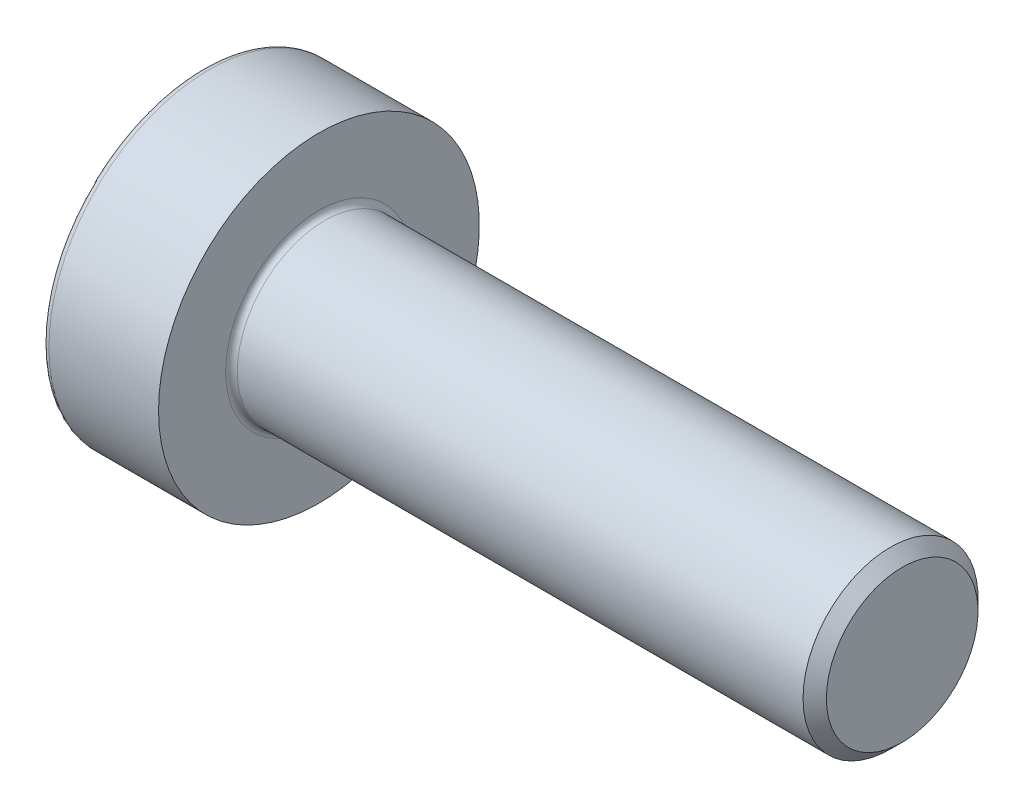
ISO-10303-21;
HEADER;
FILE_DESCRIPTION(('STEP AP214'),'2;1');
FILE_NAME('part.step','',(''),(''),'','','');
FILE_SCHEMA(('AUTOMOTIVE_DESIGN { 1 0 10303 214 1 1 1 1 }'));
ENDSEC;
DATA;
#1=APPLICATION_CONTEXT('core data for automotive mechanical design processes');
#2=APPLICATION_PROTOCOL_DEFINITION('international standard','automotive_design',2000,#1);
#3=PRODUCT_CONTEXT('',#1,'mechanical');
#4=PRODUCT('Part','Part','',(#3));
#5=PRODUCT_RELATED_PRODUCT_CATEGORY('part','',(#4));
#6=PRODUCT_DEFINITION_FORMATION('','',#4);
#7=PRODUCT_DEFINITION_CONTEXT('part definition',#1,'design');
#8=PRODUCT_DEFINITION('design','',#6,#7);
#9=PRODUCT_DEFINITION_SHAPE('','',#8);
#10=(LENGTH_UNIT() NAMED_UNIT(*) SI_UNIT(.MILLI.,.METRE.));
#11=(NAMED_UNIT(*) PLANE_ANGLE_UNIT() SI_UNIT($,.RADIAN.));
#12=(NAMED_UNIT(*) SI_UNIT($,.STERADIAN.) SOLID_ANGLE_UNIT());
#13=UNCERTAINTY_MEASURE_WITH_UNIT(LENGTH_MEASURE(1.E-05),#10,'distance_accuracy_value','');
#14=(GEOMETRIC_REPRESENTATION_CONTEXT(3) GLOBAL_UNCERTAINTY_ASSIGNED_CONTEXT((#13)) GLOBAL_UNIT_ASSIGNED_CONTEXT((#10,
#11,#12)) REPRESENTATION_CONTEXT('',''));
#15=CARTESIAN_POINT('',(0.,0.,0.));
#16=DIRECTION('',(0.,0.,1.));
#17=DIRECTION('',(1.,0.,0.));
#18=AXIS2_PLACEMENT_3D('',#15,#16,#17);
#19=CARTESIAN_POINT('',(12.,0.,0.));
#20=DIRECTION('',(-1.,0.,0.));
#21=DIRECTION('',(0.,0.,1.));
#22=AXIS2_PLACEMENT_3D('',#19,#20,#21);
#23=PLANE('',#22);
#24=CARTESIAN_POINT('',(12.,0.,0.));
#25=DIRECTION('',(-1.,0.,0.));
#26=DIRECTION('',(0.,0.,1.));
#27=AXIS2_PLACEMENT_3D('',#24,#25,#26);
#28=CIRCLE('',#27,1.3);
#29=CARTESIAN_POINT('',(12.,0.,1.3));
#30=VERTEX_POINT('',#29);
#31=EDGE_CURVE('E11',#30,#30,#28,.F.);
#32=ORIENTED_EDGE('',*,*,#31,.T.);
#33=EDGE_LOOP('',(#32));
#34=FACE_BOUND('',#33,.T.);
#35=ADVANCED_FACE('F37',(#34),#23,.F.);
#36=CARTESIAN_POINT('',(0.,0.,0.));
#37=DIRECTION('',(-1.,0.,0.));
#38=DIRECTION('',(0.,0.,1.));
#39=AXIS2_PLACEMENT_3D('',#36,#37,#38);
#40=CYLINDRICAL_SURFACE('',#39,1.5);
#41=CARTESIAN_POINT('',(11.8,0.,0.));
#42=DIRECTION('',(-1.,0.,0.));
#43=DIRECTION('',(0.,0.,1.));
#44=AXIS2_PLACEMENT_3D('',#41,#42,#43);
#45=CIRCLE('',#44,1.5);
#46=CARTESIAN_POINT('',(11.8,0.,1.5));
#47=VERTEX_POINT('',#46);
#48=EDGE_CURVE('E45',#47,#47,#45,.T.);
#49=ORIENTED_EDGE('',*,*,#48,.T.);
#50=EDGE_LOOP('',(#49));
#51=FACE_BOUND('',#50,.T.);
#52=CARTESIAN_POINT('',(2.1,0.,0.));
#53=DIRECTION('',(1.,0.,0.));
#54=DIRECTION('',(0.,0.,-1.));
#55=AXIS2_PLACEMENT_3D('',#52,#53,#54);
#56=CIRCLE('',#55,1.5);
#57=CARTESIAN_POINT('',(2.1,0.,-1.5));
#58=VERTEX_POINT('',#57);
#59=EDGE_CURVE('E150',#58,#58,#56,.T.);
#60=ORIENTED_EDGE('',*,*,#59,.T.);
#61=EDGE_LOOP('',(#60));
#62=FACE_BOUND('',#61,.T.);
#63=ADVANCED_FACE('F161',(#51,#62),#40,.T.);
#64=CARTESIAN_POINT('',(2.,0.,0.));
#65=DIRECTION('',(1.,0.,0.));
#66=DIRECTION('',(0.,0.,-1.));
#67=AXIS2_PLACEMENT_3D('',#64,#65,#66);
#68=PLANE('',#67);
#69=CARTESIAN_POINT('',(2.,0.,0.));
#70=DIRECTION('',(1.,0.,0.));
#71=DIRECTION('',(0.,0.,-1.));
#72=AXIS2_PLACEMENT_3D('',#69,#70,#71);
#73=CIRCLE('',#72,1.6);
#74=CARTESIAN_POINT('',(2.,0.,-1.6));
#75=VERTEX_POINT('',#74);
#76=EDGE_CURVE('E147',#75,#75,#73,.F.);
#77=ORIENTED_EDGE('',*,*,#76,.T.);
#78=EDGE_LOOP('',(#77));
#79=FACE_BOUND('',#78,.T.);
#80=CARTESIAN_POINT('',(2.,0.,0.));
#81=DIRECTION('',(-1.,0.,0.));
#82=DIRECTION('',(0.,0.,1.));
#83=AXIS2_PLACEMENT_3D('',#80,#81,#82);
#84=CIRCLE('',#83,2.75);
#85=CARTESIAN_POINT('',(2.,0.,2.75));
#86=VERTEX_POINT('',#85);
#87=EDGE_CURVE('E139',#86,#86,#84,.T.);
#88=ORIENTED_EDGE('',*,*,#87,.F.);
#89=EDGE_LOOP('',(#88));
#90=FACE_BOUND('',#89,.T.);
#91=ADVANCED_FACE('F183',(#79,#90),#68,.T.);
#92=CARTESIAN_POINT('',(0.,0.,0.));
#93=DIRECTION('',(-1.,0.,0.));
#94=DIRECTION('',(0.,0.,1.));
#95=AXIS2_PLACEMENT_3D('',#92,#93,#94);
#96=CYLINDRICAL_SURFACE('',#95,2.75);
#97=CARTESIAN_POINT('',(0.12,0.,0.));
#98=DIRECTION('',(-1.,0.,0.));
#99=DIRECTION('',(0.,0.,1.));
#100=AXIS2_PLACEMENT_3D('',#97,#98,#99);
#101=CIRCLE('',#100,2.75);
#102=CARTESIAN_POINT('',(0.12,0.,2.75));
#103=VERTEX_POINT('',#102);
#104=EDGE_CURVE('E156',#103,#103,#101,.F.);
#105=ORIENTED_EDGE('',*,*,#104,.T.);
#106=EDGE_LOOP('',(#105));
#107=FACE_BOUND('',#106,.T.);
#108=ORIENTED_EDGE('',*,*,#87,.T.);
#109=EDGE_LOOP('',(#108));
#110=FACE_BOUND('',#109,.T.);
#111=ADVANCED_FACE('F193',(#107,#110),#96,.T.);
#112=CARTESIAN_POINT('',(0.,0.,0.));
#113=DIRECTION('',(-1.,0.,0.));
#114=DIRECTION('',(0.,0.,1.));
#115=AXIS2_PLACEMENT_3D('',#112,#113,#114);
#116=PLANE('',#115);
#117=DIRECTION('',(0.,0.5,-0.866025403784439));
#118=VECTOR('',#117,1.);
#119=CARTESIAN_POINT('',(0.,0.721687836487033,1.25));
#120=LINE('',#119,#118);
#121=CARTESIAN_POINT('',(0.,0.721687836487033,1.25));
#122=VERTEX_POINT('',#121);
#123=CARTESIAN_POINT('',(0.,1.44337567297406,0.));
#124=VERTEX_POINT('',#123);
#125=EDGE_CURVE('E52',#122,#124,#120,.T.);
#126=ORIENTED_EDGE('',*,*,#125,.F.);
#127=DIRECTION('',(0.,1.,0.));
#128=VECTOR('',#127,1.);
#129=CARTESIAN_POINT('',(0.,-0.721687836487032,1.25));
#130=LINE('',#129,#128);
#131=CARTESIAN_POINT('',(0.,-0.721687836487032,1.25));
#132=VERTEX_POINT('',#131);
#133=EDGE_CURVE('E135',#132,#122,#130,.T.);
#134=ORIENTED_EDGE('',*,*,#133,.F.);
#135=DIRECTION('',(0.,0.5,0.866025403784439));
#136=VECTOR('',#135,1.);
#137=CARTESIAN_POINT('',(0.,-1.44337567297406,0.));
#138=LINE('',#137,#136);
#139=CARTESIAN_POINT('',(0.,-1.44337567297406,0.));
#140=VERTEX_POINT('',#139);
#141=EDGE_CURVE('E133',#140,#132,#138,.T.);
#142=ORIENTED_EDGE('',*,*,#141,.F.);
#143=DIRECTION('',(0.,-0.5,0.866025403784439));
#144=VECTOR('',#143,1.);
#145=CARTESIAN_POINT('',(0.,-0.721687836487033,-1.25));
#146=LINE('',#145,#144);
#147=CARTESIAN_POINT('',(0.,-0.721687836487033,-1.25));
#148=VERTEX_POINT('',#147);
#149=EDGE_CURVE('E100',#148,#140,#146,.T.);
#150=ORIENTED_EDGE('',*,*,#149,.F.);
#151=DIRECTION('',(0.,-1.,0.));
#152=VECTOR('',#151,1.);
#153=CARTESIAN_POINT('',(0.,0.721687836487032,-1.25));
#154=LINE('',#153,#152);
#155=CARTESIAN_POINT('',(0.,0.721687836487032,-1.25));
#156=VERTEX_POINT('',#155);
#157=EDGE_CURVE('E129',#156,#148,#154,.T.);
#158=ORIENTED_EDGE('',*,*,#157,.F.);
#159=DIRECTION('',(0.,-0.5,-0.866025403784439));
#160=VECTOR('',#159,1.);
#161=CARTESIAN_POINT('',(0.,1.44337567297406,0.));
#162=LINE('',#161,#160);
#163=EDGE_CURVE('E126',#124,#156,#162,.T.);
#164=ORIENTED_EDGE('',*,*,#163,.F.);
#165=EDGE_LOOP('',(#126,#134,#142,#150,#158,#164));
#166=FACE_BOUND('',#165,.T.);
#167=CARTESIAN_POINT('',(0.,0.,0.));
#168=DIRECTION('',(-1.,0.,0.));
#169=DIRECTION('',(0.,0.,1.));
#170=AXIS2_PLACEMENT_3D('',#167,#168,#169);
#171=CIRCLE('',#170,2.63);
#172=CARTESIAN_POINT('',(0.,0.,2.63));
#173=VERTEX_POINT('',#172);
#174=EDGE_CURVE('E153',#173,#173,#171,.T.);
#175=ORIENTED_EDGE('',*,*,#174,.T.);
#176=EDGE_LOOP('',(#175));
#177=FACE_BOUND('',#176,.T.);
#178=ADVANCED_FACE('F188',(#166,#177),#116,.T.);
#179=CARTESIAN_POINT('',(2.1,0.,0.));
#180=DIRECTION('',(1.,0.,0.));
#181=DIRECTION('',(0.,0.,-1.));
#182=AXIS2_PLACEMENT_3D('',#179,#180,#181);
#183=TOROIDAL_SURFACE('',#182,1.6,0.1);
#184=ORIENTED_EDGE('',*,*,#59,.F.);
#185=EDGE_LOOP('',(#184));
#186=FACE_BOUND('',#185,.T.);
#187=ORIENTED_EDGE('',*,*,#76,.F.);
#188=EDGE_LOOP('',(#187));
#189=FACE_BOUND('',#188,.T.);
#190=ADVANCED_FACE('F174',(#186,#189),#183,.F.);
#191=CARTESIAN_POINT('',(0.12,0.,0.));
#192=DIRECTION('',(-1.,0.,0.));
#193=DIRECTION('',(0.,0.,1.));
#194=AXIS2_PLACEMENT_3D('',#191,#192,#193);
#195=TOROIDAL_SURFACE('',#194,2.63,0.12);
#196=ORIENTED_EDGE('',*,*,#104,.F.);
#197=EDGE_LOOP('',(#196));
#198=FACE_BOUND('',#197,.T.);
#199=ORIENTED_EDGE('',*,*,#174,.F.);
#200=EDGE_LOOP('',(#199));
#201=FACE_BOUND('',#200,.T.);
#202=ADVANCED_FACE('F166',(#198,#201),#195,.T.);
#203=CARTESIAN_POINT('',(11.8,0.,0.));
#204=DIRECTION('',(-1.,0.,0.));
#205=DIRECTION('',(0.,0.,1.));
#206=AXIS2_PLACEMENT_3D('',#203,#204,#205);
#207=CONICAL_SURFACE('',#206,1.5,0.785398163397448);
#208=ORIENTED_EDGE('',*,*,#31,.F.);
#209=EDGE_LOOP('',(#208));
#210=FACE_BOUND('',#209,.T.);
#211=ORIENTED_EDGE('',*,*,#48,.F.);
#212=EDGE_LOOP('',(#211));
#213=FACE_BOUND('',#212,.T.);
#214=ADVANCED_FACE('F39',(#210,#213),#207,.T.);
#215=CARTESIAN_POINT('',(1.,0.721687836487033,1.25));
#216=DIRECTION('',(0.,0.866025403784439,0.5));
#217=DIRECTION('',(0.,-0.5,0.866025403784439));
#218=AXIS2_PLACEMENT_3D('',#215,#216,#217);
#219=PLANE('',#218);
#220=ORIENTED_EDGE('',*,*,#125,.T.);
#221=DIRECTION('',(-1.,0.,0.));
#222=VECTOR('',#221,1.);
#223=CARTESIAN_POINT('',(1.,1.44337567297406,0.));
#224=LINE('',#223,#222);
#225=CARTESIAN_POINT('',(1.,1.44337567297406,0.));
#226=VERTEX_POINT('',#225);
#227=EDGE_CURVE('E82',#226,#124,#224,.T.);
#228=ORIENTED_EDGE('',*,*,#227,.F.);
#229=DIRECTION('',(0.,0.5,-0.866025403784439));
#230=VECTOR('',#229,1.);
#231=CARTESIAN_POINT('',(1.,0.721687836487033,1.25));
#232=LINE('',#231,#230);
#233=CARTESIAN_POINT('',(1.,0.721687836487033,1.25));
#234=VERTEX_POINT('',#233);
#235=EDGE_CURVE('E137',#234,#226,#232,.T.);
#236=ORIENTED_EDGE('',*,*,#235,.F.);
#237=DIRECTION('',(-1.,0.,0.));
#238=VECTOR('',#237,1.);
#239=CARTESIAN_POINT('',(1.,0.721687836487033,1.25));
#240=LINE('',#239,#238);
#241=EDGE_CURVE('E60',#234,#122,#240,.T.);
#242=ORIENTED_EDGE('',*,*,#241,.T.);
#243=EDGE_LOOP('',(#220,#228,#236,#242));
#244=FACE_BOUND('',#243,.T.);
#245=ADVANCED_FACE('F165',(#244),#219,.F.);
#246=CARTESIAN_POINT('',(1.,-0.721687836487032,1.25));
#247=DIRECTION('',(0.,0.,1.));
#248=DIRECTION('',(0.,-1.,0.));
#249=AXIS2_PLACEMENT_3D('',#246,#247,#248);
#250=PLANE('',#249);
#251=ORIENTED_EDGE('',*,*,#133,.T.);
#252=ORIENTED_EDGE('',*,*,#241,.F.);
#253=DIRECTION('',(0.,1.,0.));
#254=VECTOR('',#253,1.);
#255=CARTESIAN_POINT('',(1.,-0.721687836487032,1.25));
#256=LINE('',#255,#254);
#257=CARTESIAN_POINT('',(1.,-0.721687836487032,1.25));
#258=VERTEX_POINT('',#257);
#259=EDGE_CURVE('E112',#258,#234,#256,.T.);
#260=ORIENTED_EDGE('',*,*,#259,.F.);
#261=DIRECTION('',(-1.,0.,0.));
#262=VECTOR('',#261,1.);
#263=CARTESIAN_POINT('',(1.,-0.721687836487032,1.25));
#264=LINE('',#263,#262);
#265=EDGE_CURVE('E104',#258,#132,#264,.T.);
#266=ORIENTED_EDGE('',*,*,#265,.T.);
#267=EDGE_LOOP('',(#251,#252,#260,#266));
#268=FACE_BOUND('',#267,.T.);
#269=ADVANCED_FACE('F172',(#268),#250,.F.);
#270=CARTESIAN_POINT('',(1.,-1.44337567297406,0.));
#271=DIRECTION('',(0.,-0.866025403784439,0.5));
#272=DIRECTION('',(0.,-0.5,-0.866025403784439));
#273=AXIS2_PLACEMENT_3D('',#270,#271,#272);
#274=PLANE('',#273);
#275=ORIENTED_EDGE('',*,*,#141,.T.);
#276=ORIENTED_EDGE('',*,*,#265,.F.);
#277=DIRECTION('',(0.,0.5,0.866025403784439));
#278=VECTOR('',#277,1.);
#279=CARTESIAN_POINT('',(1.,-1.44337567297406,0.));
#280=LINE('',#279,#278);
#281=CARTESIAN_POINT('',(1.,-1.44337567297406,0.));
#282=VERTEX_POINT('',#281);
#283=EDGE_CURVE('E108',#282,#258,#280,.T.);
#284=ORIENTED_EDGE('',*,*,#283,.F.);
#285=DIRECTION('',(-1.,0.,0.));
#286=VECTOR('',#285,1.);
#287=CARTESIAN_POINT('',(1.,-1.44337567297406,0.));
#288=LINE('',#287,#286);
#289=EDGE_CURVE('E93',#282,#140,#288,.T.);
#290=ORIENTED_EDGE('',*,*,#289,.T.);
#291=EDGE_LOOP('',(#275,#276,#284,#290));
#292=FACE_BOUND('',#291,.T.);
#293=ADVANCED_FACE('F109',(#292),#274,.F.);
#294=CARTESIAN_POINT('',(1.,-0.721687836487033,-1.25));
#295=DIRECTION('',(0.,-0.866025403784439,-0.5));
#296=DIRECTION('',(0.,0.5,-0.866025403784439));
#297=AXIS2_PLACEMENT_3D('',#294,#295,#296);
#298=PLANE('',#297);
#299=ORIENTED_EDGE('',*,*,#149,.T.);
#300=ORIENTED_EDGE('',*,*,#289,.F.);
#301=DIRECTION('',(0.,-0.5,0.866025403784439));
#302=VECTOR('',#301,1.);
#303=CARTESIAN_POINT('',(1.,-0.721687836487033,-1.25));
#304=LINE('',#303,#302);
#305=CARTESIAN_POINT('',(1.,-0.721687836487033,-1.25));
#306=VERTEX_POINT('',#305);
#307=EDGE_CURVE('E97',#306,#282,#304,.T.);
#308=ORIENTED_EDGE('',*,*,#307,.F.);
#309=DIRECTION('',(-1.,0.,0.));
#310=VECTOR('',#309,1.);
#311=CARTESIAN_POINT('',(1.,-0.721687836487033,-1.25));
#312=LINE('',#311,#310);
#313=EDGE_CURVE('E105',#306,#148,#312,.T.);
#314=ORIENTED_EDGE('',*,*,#313,.T.);
#315=EDGE_LOOP('',(#299,#300,#308,#314));
#316=FACE_BOUND('',#315,.T.);
#317=ADVANCED_FACE('F95',(#316),#298,.F.);
#318=CARTESIAN_POINT('',(1.,0.721687836487032,-1.25));
#319=DIRECTION('',(0.,0.,-1.));
#320=DIRECTION('',(0.,1.,0.));
#321=AXIS2_PLACEMENT_3D('',#318,#319,#320);
#322=PLANE('',#321);
#323=ORIENTED_EDGE('',*,*,#157,.T.);
#324=ORIENTED_EDGE('',*,*,#313,.F.);
#325=DIRECTION('',(0.,-1.,0.));
#326=VECTOR('',#325,1.);
#327=CARTESIAN_POINT('',(1.,0.721687836487032,-1.25));
#328=LINE('',#327,#326);
#329=CARTESIAN_POINT('',(1.,0.721687836487032,-1.25));
#330=VERTEX_POINT('',#329);
#331=EDGE_CURVE('E118',#330,#306,#328,.T.);
#332=ORIENTED_EDGE('',*,*,#331,.F.);
#333=DIRECTION('',(-1.,0.,0.));
#334=VECTOR('',#333,1.);
#335=CARTESIAN_POINT('',(1.,0.721687836487032,-1.25));
#336=LINE('',#335,#334);
#337=EDGE_CURVE('E142',#330,#156,#336,.T.);
#338=ORIENTED_EDGE('',*,*,#337,.T.);
#339=EDGE_LOOP('',(#323,#324,#332,#338));
#340=FACE_BOUND('',#339,.T.);
#341=ADVANCED_FACE('F213',(#340),#322,.F.);
#342=CARTESIAN_POINT('',(1.,1.44337567297406,0.));
#343=DIRECTION('',(0.,0.866025403784439,-0.5));
#344=DIRECTION('',(0.,0.5,0.866025403784439));
#345=AXIS2_PLACEMENT_3D('',#342,#343,#344);
#346=PLANE('',#345);
#347=ORIENTED_EDGE('',*,*,#163,.T.);
#348=ORIENTED_EDGE('',*,*,#337,.F.);
#349=DIRECTION('',(0.,-0.5,-0.866025403784439));
#350=VECTOR('',#349,1.);
#351=CARTESIAN_POINT('',(1.,1.44337567297406,0.));
#352=LINE('',#351,#350);
#353=EDGE_CURVE('E120',#226,#330,#352,.T.);
#354=ORIENTED_EDGE('',*,*,#353,.F.);
#355=ORIENTED_EDGE('',*,*,#227,.T.);
#356=EDGE_LOOP('',(#347,#348,#354,#355));
#357=FACE_BOUND('',#356,.T.);
#358=ADVANCED_FACE('F210',(#357),#346,.F.);
#359=CARTESIAN_POINT('',(1.,0.,0.));
#360=DIRECTION('',(-1.,0.,0.));
#361=DIRECTION('',(0.,0.,1.));
#362=AXIS2_PLACEMENT_3D('',#359,#360,#361);
#363=PLANE('',#362);
#364=ORIENTED_EDGE('',*,*,#235,.T.);
#365=ORIENTED_EDGE('',*,*,#353,.T.);
#366=ORIENTED_EDGE('',*,*,#331,.T.);
#367=ORIENTED_EDGE('',*,*,#307,.T.);
#368=ORIENTED_EDGE('',*,*,#283,.T.);
#369=ORIENTED_EDGE('',*,*,#259,.T.);
#370=EDGE_LOOP('',(#364,#365,#366,#367,#368,#369));
#371=FACE_BOUND('',#370,.T.);
#372=ADVANCED_FACE('F115',(#371),#363,.T.);
#373=CLOSED_SHELL('',(#35,#63,#91,#111,#178,#190,#202,#214,#245,#269,#293,#317,#341,#358,#372));
#374=MANIFOLD_SOLID_BREP('B2',#373);
#375=ADVANCED_BREP_SHAPE_REPRESENTATION('',(#18,#374),#14);
#376=SHAPE_DEFINITION_REPRESENTATION(#9,#375);
ENDSEC;
END-ISO-10303-21;
